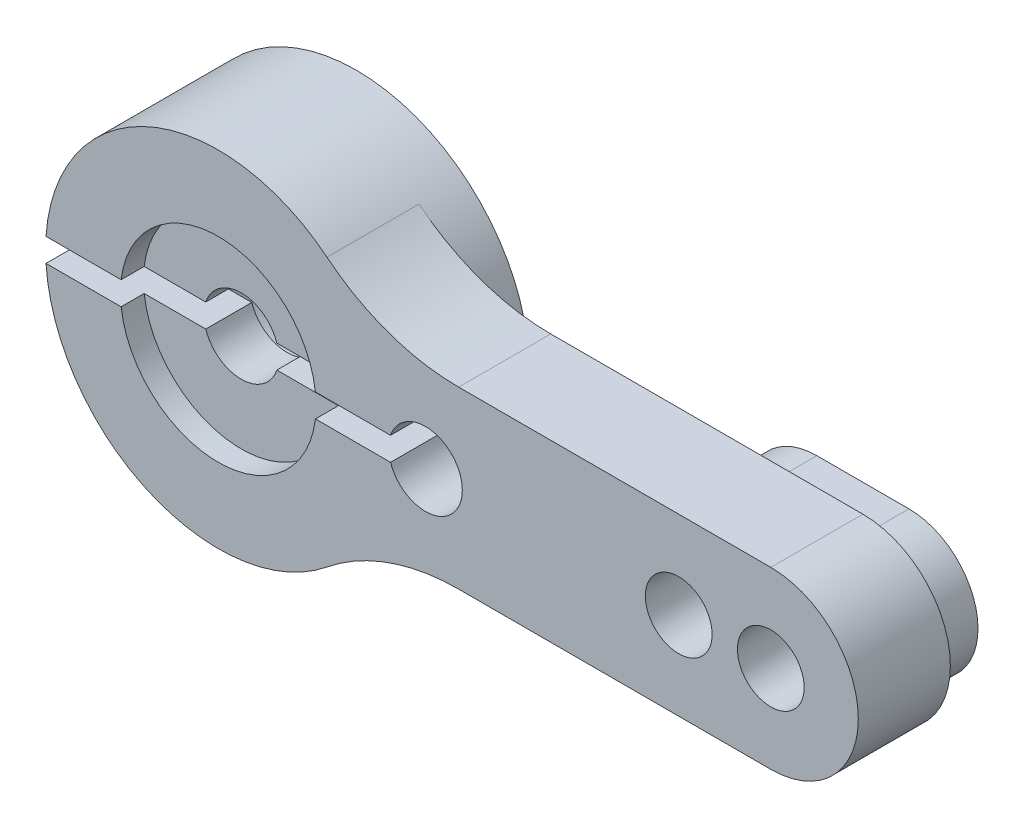
ISO-10303-21;
HEADER;
FILE_DESCRIPTION(('STEP AP214'),'2;1');
FILE_NAME('part.step','',(''),(''),'','','');
FILE_SCHEMA(('AUTOMOTIVE_DESIGN { 1 0 10303 214 1 1 1 1 }'));
ENDSEC;
DATA;
#1=APPLICATION_CONTEXT('core data for automotive mechanical design processes');
#2=APPLICATION_PROTOCOL_DEFINITION('international standard','automotive_design',2000,#1);
#3=PRODUCT_CONTEXT('',#1,'mechanical');
#4=PRODUCT('Part','Part','',(#3));
#5=PRODUCT_RELATED_PRODUCT_CATEGORY('part','',(#4));
#6=PRODUCT_DEFINITION_FORMATION('','',#4);
#7=PRODUCT_DEFINITION_CONTEXT('part definition',#1,'design');
#8=PRODUCT_DEFINITION('design','',#6,#7);
#9=PRODUCT_DEFINITION_SHAPE('','',#8);
#10=(LENGTH_UNIT() NAMED_UNIT(*) SI_UNIT(.MILLI.,.METRE.));
#11=(NAMED_UNIT(*) PLANE_ANGLE_UNIT() SI_UNIT($,.RADIAN.));
#12=(NAMED_UNIT(*) SI_UNIT($,.STERADIAN.) SOLID_ANGLE_UNIT());
#13=UNCERTAINTY_MEASURE_WITH_UNIT(LENGTH_MEASURE(1.E-05),#10,'distance_accuracy_value','');
#14=(GEOMETRIC_REPRESENTATION_CONTEXT(3) GLOBAL_UNCERTAINTY_ASSIGNED_CONTEXT((#13)) GLOBAL_UNIT_ASSIGNED_CONTEXT((#10,
#11,#12)) REPRESENTATION_CONTEXT('',''));
#15=CARTESIAN_POINT('',(0.,0.,0.));
#16=DIRECTION('',(0.,0.,1.));
#17=DIRECTION('',(1.,0.,0.));
#18=AXIS2_PLACEMENT_3D('',#15,#16,#17);
#19=CARTESIAN_POINT('',(0.,0.,4.));
#20=DIRECTION('',(0.,0.,-1.));
#21=DIRECTION('',(-1.,0.,0.));
#22=AXIS2_PLACEMENT_3D('',#19,#20,#21);
#23=CYLINDRICAL_SURFACE('',#22,1.625);
#24=DIRECTION('',(0.,0.,-1.));
#25=VECTOR('',#24,1.);
#26=CARTESIAN_POINT('',(-1.54356349775607,0.507973157159964,4.));
#27=LINE('',#26,#25);
#28=CARTESIAN_POINT('',(-1.54356349775607,0.507973157159964,3.));
#29=VERTEX_POINT('',#28);
#30=CARTESIAN_POINT('',(-1.54356349775607,0.507973157159964,1.));
#31=VERTEX_POINT('',#30);
#32=EDGE_CURVE('E459',#29,#31,#27,.T.);
#33=ORIENTED_EDGE('',*,*,#32,.T.);
#34=CARTESIAN_POINT('',(0.,0.,1.));
#35=DIRECTION('',(0.,0.,-1.));
#36=DIRECTION('',(-1.,0.,0.));
#37=AXIS2_PLACEMENT_3D('',#34,#35,#36);
#38=CIRCLE('',#37,1.625);
#39=CARTESIAN_POINT('',(1.54356349775607,0.507973157159964,1.));
#40=VERTEX_POINT('',#39);
#41=EDGE_CURVE('E253',#31,#40,#38,.T.);
#42=ORIENTED_EDGE('',*,*,#41,.T.);
#43=DIRECTION('',(0.,0.,-1.));
#44=VECTOR('',#43,1.);
#45=CARTESIAN_POINT('',(1.54356349775607,0.507973157159964,4.));
#46=LINE('',#45,#44);
#47=CARTESIAN_POINT('',(1.54356349775607,0.507973157159964,3.));
#48=VERTEX_POINT('',#47);
#49=EDGE_CURVE('E374',#48,#40,#46,.T.);
#50=ORIENTED_EDGE('',*,*,#49,.F.);
#51=CARTESIAN_POINT('',(0.,0.,3.));
#52=DIRECTION('',(0.,0.,1.));
#53=DIRECTION('',(1.,0.,0.));
#54=AXIS2_PLACEMENT_3D('',#51,#52,#53);
#55=CIRCLE('',#54,1.625);
#56=EDGE_CURVE('E298',#48,#29,#55,.T.);
#57=ORIENTED_EDGE('',*,*,#56,.T.);
#58=EDGE_LOOP('',(#33,#42,#50,#57));
#59=FACE_BOUND('',#58,.T.);
#60=ADVANCED_FACE('F52',(#59),#23,.F.);
#61=CARTESIAN_POINT('',(0.,0.,4.));
#62=DIRECTION('',(0.,0.,-1.));
#63=DIRECTION('',(-1.,0.,0.));
#64=AXIS2_PLACEMENT_3D('',#61,#62,#63);
#65=CYLINDRICAL_SURFACE('',#64,1.625);
#66=DIRECTION('',(0.,0.,-1.));
#67=VECTOR('',#66,1.);
#68=CARTESIAN_POINT('',(1.54356349775606,-0.507973157159965,4.));
#69=LINE('',#68,#67);
#70=CARTESIAN_POINT('',(1.54356349775606,-0.507973157159965,3.));
#71=VERTEX_POINT('',#70);
#72=CARTESIAN_POINT('',(1.54356349775606,-0.507973157159965,1.));
#73=VERTEX_POINT('',#72);
#74=EDGE_CURVE('E520',#71,#73,#69,.T.);
#75=ORIENTED_EDGE('',*,*,#74,.T.);
#76=CARTESIAN_POINT('',(0.,0.,1.));
#77=DIRECTION('',(0.,0.,-1.));
#78=DIRECTION('',(-1.,0.,0.));
#79=AXIS2_PLACEMENT_3D('',#76,#77,#78);
#80=CIRCLE('',#79,1.625);
#81=CARTESIAN_POINT('',(-1.54356349775606,-0.507973157159965,1.));
#82=VERTEX_POINT('',#81);
#83=EDGE_CURVE('E271',#73,#82,#80,.T.);
#84=ORIENTED_EDGE('',*,*,#83,.T.);
#85=DIRECTION('',(0.,0.,-1.));
#86=VECTOR('',#85,1.);
#87=CARTESIAN_POINT('',(-1.54356349775606,-0.507973157159965,4.));
#88=LINE('',#87,#86);
#89=CARTESIAN_POINT('',(-1.54356349775606,-0.507973157159965,3.));
#90=VERTEX_POINT('',#89);
#91=EDGE_CURVE('E516',#90,#82,#88,.T.);
#92=ORIENTED_EDGE('',*,*,#91,.F.);
#93=CARTESIAN_POINT('',(0.,0.,3.));
#94=DIRECTION('',(0.,0.,1.));
#95=DIRECTION('',(1.,0.,0.));
#96=AXIS2_PLACEMENT_3D('',#93,#94,#95);
#97=CIRCLE('',#96,1.625);
#98=EDGE_CURVE('E309',#90,#71,#97,.T.);
#99=ORIENTED_EDGE('',*,*,#98,.T.);
#100=EDGE_LOOP('',(#75,#84,#92,#99));
#101=FACE_BOUND('',#100,.T.);
#102=ADVANCED_FACE('F588',(#101),#65,.F.);
#103=CARTESIAN_POINT('',(0.,0.,0.));
#104=DIRECTION('',(0.,0.,1.));
#105=DIRECTION('',(1.,0.,0.));
#106=AXIS2_PLACEMENT_3D('',#103,#104,#105);
#107=PLANE('',#106);
#108=CARTESIAN_POINT('',(20.,0.,0.));
#109=DIRECTION('',(0.,0.,-1.));
#110=DIRECTION('',(-1.,0.,0.));
#111=AXIS2_PLACEMENT_3D('',#108,#109,#110);
#112=CIRCLE('',#111,3.);
#113=CARTESIAN_POINT('',(20.,-3.,0.));
#114=VERTEX_POINT('',#113);
#115=CARTESIAN_POINT('',(20.,3.,0.));
#116=VERTEX_POINT('',#115);
#117=EDGE_CURVE('E347',#114,#116,#112,.T.);
#118=ORIENTED_EDGE('',*,*,#117,.F.);
#119=DIRECTION('',(-1.,0.,0.));
#120=VECTOR('',#119,1.);
#121=CARTESIAN_POINT('',(20.,-3.,0.));
#122=LINE('',#121,#120);
#123=CARTESIAN_POINT('',(24.,-3.,0.));
#124=VERTEX_POINT('',#123);
#125=EDGE_CURVE('E334',#124,#114,#122,.T.);
#126=ORIENTED_EDGE('',*,*,#125,.F.);
#127=CARTESIAN_POINT('',(24.,0.,0.));
#128=DIRECTION('',(0.,0.,-1.));
#129=DIRECTION('',(-1.,0.,0.));
#130=AXIS2_PLACEMENT_3D('',#127,#128,#129);
#131=CIRCLE('',#130,3.);
#132=CARTESIAN_POINT('',(24.,3.,0.));
#133=VERTEX_POINT('',#132);
#134=EDGE_CURVE('E338',#133,#124,#131,.T.);
#135=ORIENTED_EDGE('',*,*,#134,.F.);
#136=DIRECTION('',(1.,0.,0.));
#137=VECTOR('',#136,1.);
#138=CARTESIAN_POINT('',(24.,3.,0.));
#139=LINE('',#138,#137);
#140=EDGE_CURVE('E343',#116,#133,#139,.T.);
#141=ORIENTED_EDGE('',*,*,#140,.F.);
#142=EDGE_LOOP('',(#118,#126,#135,#141));
#143=FACE_BOUND('',#142,.T.);
#144=CARTESIAN_POINT('',(0.,0.,0.));
#145=DIRECTION('',(0.,0.,-1.));
#146=DIRECTION('',(-1.,0.,0.));
#147=AXIS2_PLACEMENT_3D('',#144,#145,#146);
#148=CIRCLE('',#147,7.5);
#149=CARTESIAN_POINT('',(4.72209122449602,5.82682198694434,0.));
#150=VERTEX_POINT('',#149);
#151=CARTESIAN_POINT('',(7.48277777777778,0.507973157159964,0.));
#152=VERTEX_POINT('',#151);
#153=EDGE_CURVE('E369',#150,#152,#148,.T.);
#154=ORIENTED_EDGE('',*,*,#153,.F.);
#155=CARTESIAN_POINT('',(10.4422466673028,12.8852047919995,0.));
#156=DIRECTION('',(0.,0.,1.));
#157=DIRECTION('',(1.,0.,0.));
#158=AXIS2_PLACEMENT_3D('',#155,#156,#157);
#159=CIRCLE('',#158,9.08520479199948);
#160=CARTESIAN_POINT('',(10.4422466673028,3.8,0.));
#161=VERTEX_POINT('',#160);
#162=EDGE_CURVE('E476',#150,#161,#159,.T.);
#163=ORIENTED_EDGE('',*,*,#162,.T.);
#164=DIRECTION('',(-1.,0.,0.));
#165=VECTOR('',#164,1.);
#166=CARTESIAN_POINT('',(0.,3.8,0.));
#167=LINE('',#166,#165);
#168=CARTESIAN_POINT('',(24.,3.8,0.));
#169=VERTEX_POINT('',#168);
#170=EDGE_CURVE('E472',#169,#161,#167,.T.);
#171=ORIENTED_EDGE('',*,*,#170,.F.);
#172=CARTESIAN_POINT('',(24.,0.,0.));
#173=DIRECTION('',(0.,0.,1.));
#174=DIRECTION('',(1.,0.,0.));
#175=AXIS2_PLACEMENT_3D('',#172,#173,#174);
#176=CIRCLE('',#175,3.8);
#177=CARTESIAN_POINT('',(24.,-3.8,0.));
#178=VERTEX_POINT('',#177);
#179=EDGE_CURVE('E469',#178,#169,#176,.T.);
#180=ORIENTED_EDGE('',*,*,#179,.F.);
#181=DIRECTION('',(1.,0.,0.));
#182=VECTOR('',#181,1.);
#183=CARTESIAN_POINT('',(0.,-3.8,0.));
#184=LINE('',#183,#182);
#185=CARTESIAN_POINT('',(10.4422466673028,-3.8,0.));
#186=VERTEX_POINT('',#185);
#187=EDGE_CURVE('E466',#186,#178,#184,.T.);
#188=ORIENTED_EDGE('',*,*,#187,.F.);
#189=CARTESIAN_POINT('',(10.4422466673028,-12.8852047919995,0.));
#190=DIRECTION('',(0.,0.,1.));
#191=DIRECTION('',(1.,0.,0.));
#192=AXIS2_PLACEMENT_3D('',#189,#190,#191);
#193=CIRCLE('',#192,9.08520479199948);
#194=CARTESIAN_POINT('',(4.72209122449602,-5.82682198694434,0.));
#195=VERTEX_POINT('',#194);
#196=EDGE_CURVE('E462',#186,#195,#193,.T.);
#197=ORIENTED_EDGE('',*,*,#196,.T.);
#198=CARTESIAN_POINT('',(0.,0.,0.));
#199=DIRECTION('',(0.,0.,-1.));
#200=DIRECTION('',(-1.,0.,0.));
#201=AXIS2_PLACEMENT_3D('',#198,#199,#200);
#202=CIRCLE('',#201,7.5);
#203=CARTESIAN_POINT('',(7.48277777777778,-0.507973157159965,0.));
#204=VERTEX_POINT('',#203);
#205=EDGE_CURVE('E351',#204,#195,#202,.T.);
#206=ORIENTED_EDGE('',*,*,#205,.F.);
#207=CARTESIAN_POINT('',(9.,0.,0.));
#208=DIRECTION('',(0.,0.,1.));
#209=DIRECTION('',(1.,0.,0.));
#210=AXIS2_PLACEMENT_3D('',#207,#208,#209);
#211=CIRCLE('',#210,1.6);
#212=EDGE_CURVE('E410',#204,#152,#211,.T.);
#213=ORIENTED_EDGE('',*,*,#212,.T.);
#214=EDGE_LOOP('',(#154,#163,#171,#180,#188,#197,#206,#213));
#215=FACE_BOUND('',#214,.T.);
#216=ADVANCED_FACE('F563',(#143,#215),#107,.F.);
#217=CARTESIAN_POINT('',(0.,0.507973157159964,4.));
#218=DIRECTION('',(0.,-1.,0.));
#219=DIRECTION('',(0.,0.,-1.));
#220=AXIS2_PLACEMENT_3D('',#217,#218,#219);
#221=PLANE('',#220);
#222=DIRECTION('',(1.,0.,0.));
#223=VECTOR('',#222,1.);
#224=CARTESIAN_POINT('',(0.,0.507973157159964,1.));
#225=LINE('',#224,#223);
#226=CARTESIAN_POINT('',(2.85516431604294,0.507973157159964,1.));
#227=VERTEX_POINT('',#226);
#228=EDGE_CURVE('E262',#40,#227,#225,.T.);
#229=ORIENTED_EDGE('',*,*,#228,.T.);
#230=DIRECTION('',(0.,0.,1.));
#231=VECTOR('',#230,1.);
#232=CARTESIAN_POINT('',(2.85516431604294,0.507973157159964,-2.));
#233=LINE('',#232,#231);
#234=CARTESIAN_POINT('',(2.85516431604294,0.507973157159964,-2.));
#235=VERTEX_POINT('',#234);
#236=EDGE_CURVE('E256',#235,#227,#233,.T.);
#237=ORIENTED_EDGE('',*,*,#236,.F.);
#238=DIRECTION('',(-1.,0.,0.));
#239=VECTOR('',#238,1.);
#240=CARTESIAN_POINT('',(7.48277777777778,0.507973157159964,-2.));
#241=LINE('',#240,#239);
#242=CARTESIAN_POINT('',(7.48277777777778,0.507973157159964,-2.));
#243=VERTEX_POINT('',#242);
#244=EDGE_CURVE('E368',#243,#235,#241,.T.);
#245=ORIENTED_EDGE('',*,*,#244,.F.);
#246=DIRECTION('',(0.,0.,1.));
#247=VECTOR('',#246,1.);
#248=CARTESIAN_POINT('',(7.48277777777778,0.507973157159964,-2.));
#249=LINE('',#248,#247);
#250=EDGE_CURVE('E244',#243,#152,#249,.T.);
#251=ORIENTED_EDGE('',*,*,#250,.T.);
#252=DIRECTION('',(0.,0.,-1.));
#253=VECTOR('',#252,1.);
#254=CARTESIAN_POINT('',(7.48277777777778,0.507973157159964,4.));
#255=LINE('',#254,#253);
#256=CARTESIAN_POINT('',(7.48277777777778,0.507973157159964,4.));
#257=VERTEX_POINT('',#256);
#258=EDGE_CURVE('E528',#257,#152,#255,.T.);
#259=ORIENTED_EDGE('',*,*,#258,.F.);
#260=DIRECTION('',(-1.,0.,0.));
#261=VECTOR('',#260,1.);
#262=CARTESIAN_POINT('',(0.,0.507973157159964,4.));
#263=LINE('',#262,#261);
#264=CARTESIAN_POINT('',(4.21953353720585,0.507973157159964,4.));
#265=VERTEX_POINT('',#264);
#266=EDGE_CURVE('E411',#257,#265,#263,.T.);
#267=ORIENTED_EDGE('',*,*,#266,.T.);
#268=DIRECTION('',(0.,0.,1.));
#269=VECTOR('',#268,1.);
#270=CARTESIAN_POINT('',(4.21953353720585,0.507973157159964,3.));
#271=LINE('',#270,#269);
#272=CARTESIAN_POINT('',(4.21953353720585,0.507973157159964,3.));
#273=VERTEX_POINT('',#272);
#274=EDGE_CURVE('E75',#273,#265,#271,.T.);
#275=ORIENTED_EDGE('',*,*,#274,.F.);
#276=DIRECTION('',(-1.,0.,0.));
#277=VECTOR('',#276,1.);
#278=CARTESIAN_POINT('',(0.,0.507973157159964,3.));
#279=LINE('',#278,#277);
#280=EDGE_CURVE('E302',#273,#48,#279,.T.);
#281=ORIENTED_EDGE('',*,*,#280,.T.);
#282=ORIENTED_EDGE('',*,*,#49,.T.);
#283=EDGE_LOOP('',(#229,#237,#245,#251,#259,#267,#275,#281,#282));
#284=FACE_BOUND('',#283,.T.);
#285=ADVANCED_FACE('F543',(#284),#221,.T.);
#286=CARTESIAN_POINT('',(9.,0.,4.));
#287=DIRECTION('',(0.,0.,-1.));
#288=DIRECTION('',(-1.,0.,0.));
#289=AXIS2_PLACEMENT_3D('',#286,#287,#288);
#290=CYLINDRICAL_SURFACE('',#289,1.6);
#291=ORIENTED_EDGE('',*,*,#212,.F.);
#292=DIRECTION('',(0.,0.,-1.));
#293=VECTOR('',#292,1.);
#294=CARTESIAN_POINT('',(7.48277777777778,-0.507973157159965,4.));
#295=LINE('',#294,#293);
#296=CARTESIAN_POINT('',(7.48277777777778,-0.507973157159965,4.));
#297=VERTEX_POINT('',#296);
#298=EDGE_CURVE('E524',#297,#204,#295,.T.);
#299=ORIENTED_EDGE('',*,*,#298,.F.);
#300=CARTESIAN_POINT('',(9.,0.,4.));
#301=DIRECTION('',(0.,0.,1.));
#302=DIRECTION('',(1.,0.,0.));
#303=AXIS2_PLACEMENT_3D('',#300,#301,#302);
#304=CIRCLE('',#303,1.6);
#305=EDGE_CURVE('E415',#297,#257,#304,.T.);
#306=ORIENTED_EDGE('',*,*,#305,.T.);
#307=ORIENTED_EDGE('',*,*,#258,.T.);
#308=EDGE_LOOP('',(#291,#299,#306,#307));
#309=FACE_BOUND('',#308,.T.);
#310=ADVANCED_FACE('F568',(#309),#290,.F.);
#311=CARTESIAN_POINT('',(0.,-0.507973157159965,4.));
#312=DIRECTION('',(0.,1.,0.));
#313=DIRECTION('',(0.,0.,1.));
#314=AXIS2_PLACEMENT_3D('',#311,#312,#313);
#315=PLANE('',#314);
#316=DIRECTION('',(0.,0.,1.));
#317=VECTOR('',#316,1.);
#318=CARTESIAN_POINT('',(2.85516431604294,-0.507973157159963,-2.));
#319=LINE('',#318,#317);
#320=CARTESIAN_POINT('',(2.85516431604294,-0.507973157159963,-2.));
#321=VERTEX_POINT('',#320);
#322=CARTESIAN_POINT('',(2.85516431604294,-0.507973157159965,1.));
#323=VERTEX_POINT('',#322);
#324=EDGE_CURVE('E404',#321,#323,#319,.T.);
#325=ORIENTED_EDGE('',*,*,#324,.T.);
#326=DIRECTION('',(-1.,0.,0.));
#327=VECTOR('',#326,1.);
#328=CARTESIAN_POINT('',(0.,-0.507973157159965,1.));
#329=LINE('',#328,#327);
#330=EDGE_CURVE('E275',#323,#73,#329,.T.);
#331=ORIENTED_EDGE('',*,*,#330,.T.);
#332=ORIENTED_EDGE('',*,*,#74,.F.);
#333=DIRECTION('',(1.,0.,0.));
#334=VECTOR('',#333,1.);
#335=CARTESIAN_POINT('',(0.,-0.507973157159965,3.));
#336=LINE('',#335,#334);
#337=CARTESIAN_POINT('',(4.21953353720585,-0.507973157159965,3.));
#338=VERTEX_POINT('',#337);
#339=EDGE_CURVE('E245',#71,#338,#336,.T.);
#340=ORIENTED_EDGE('',*,*,#339,.T.);
#341=DIRECTION('',(0.,0.,1.));
#342=VECTOR('',#341,1.);
#343=CARTESIAN_POINT('',(4.21953353720585,-0.507973157159965,3.));
#344=LINE('',#343,#342);
#345=CARTESIAN_POINT('',(4.21953353720585,-0.507973157159965,4.));
#346=VERTEX_POINT('',#345);
#347=EDGE_CURVE('E293',#346,#338,#344,.F.);
#348=ORIENTED_EDGE('',*,*,#347,.F.);
#349=DIRECTION('',(1.,0.,0.));
#350=VECTOR('',#349,1.);
#351=CARTESIAN_POINT('',(0.,-0.507973157159965,4.));
#352=LINE('',#351,#350);
#353=EDGE_CURVE('E420',#346,#297,#352,.T.);
#354=ORIENTED_EDGE('',*,*,#353,.T.);
#355=ORIENTED_EDGE('',*,*,#298,.T.);
#356=DIRECTION('',(0.,0.,1.));
#357=VECTOR('',#356,1.);
#358=CARTESIAN_POINT('',(7.48277777777778,-0.507973157159965,-2.));
#359=LINE('',#358,#357);
#360=CARTESIAN_POINT('',(7.48277777777778,-0.507973157159965,-2.));
#361=VERTEX_POINT('',#360);
#362=EDGE_CURVE('E397',#361,#204,#359,.T.);
#363=ORIENTED_EDGE('',*,*,#362,.F.);
#364=DIRECTION('',(1.,0.,0.));
#365=VECTOR('',#364,1.);
#366=CARTESIAN_POINT('',(7.48277777777778,-0.507973157159965,-2.));
#367=LINE('',#366,#365);
#368=EDGE_CURVE('E394',#321,#361,#367,.T.);
#369=ORIENTED_EDGE('',*,*,#368,.F.);
#370=EDGE_LOOP('',(#325,#331,#332,#340,#348,#354,#355,#363,#369));
#371=FACE_BOUND('',#370,.T.);
#372=ADVANCED_FACE('F574',(#371),#315,.T.);
#373=CARTESIAN_POINT('',(0.,-0.507973157159965,4.));
#374=DIRECTION('',(0.,-1.,0.));
#375=DIRECTION('',(0.,0.,-1.));
#376=AXIS2_PLACEMENT_3D('',#373,#374,#375);
#377=PLANE('',#376);
#378=DIRECTION('',(1.,0.,0.));
#379=VECTOR('',#378,1.);
#380=CARTESIAN_POINT('',(0.,-0.507973157159965,1.));
#381=LINE('',#380,#379);
#382=CARTESIAN_POINT('',(-2.85516431604294,-0.507973157159965,1.));
#383=VERTEX_POINT('',#382);
#384=EDGE_CURVE('E268',#383,#82,#381,.T.);
#385=ORIENTED_EDGE('',*,*,#384,.F.);
#386=DIRECTION('',(0.,0.,1.));
#387=VECTOR('',#386,1.);
#388=CARTESIAN_POINT('',(-2.85516431604294,-0.507973157159965,-2.));
#389=LINE('',#388,#387);
#390=CARTESIAN_POINT('',(-2.85516431604294,-0.507973157159965,-2.));
#391=VERTEX_POINT('',#390);
#392=EDGE_CURVE('E407',#391,#383,#389,.T.);
#393=ORIENTED_EDGE('',*,*,#392,.F.);
#394=DIRECTION('',(1.,0.,0.));
#395=VECTOR('',#394,1.);
#396=CARTESIAN_POINT('',(-7.48277777777778,-0.507973157159965,-2.));
#397=LINE('',#396,#395);
#398=CARTESIAN_POINT('',(-7.48277777777778,-0.507973157159965,-2.));
#399=VERTEX_POINT('',#398);
#400=EDGE_CURVE('E388',#399,#391,#397,.T.);
#401=ORIENTED_EDGE('',*,*,#400,.F.);
#402=DIRECTION('',(0.,0.,-1.));
#403=VECTOR('',#402,1.);
#404=CARTESIAN_POINT('',(-7.48277777777778,-0.507973157159965,4.));
#405=LINE('',#404,#403);
#406=CARTESIAN_POINT('',(-7.48277777777778,-0.507973157159965,4.));
#407=VERTEX_POINT('',#406);
#408=EDGE_CURVE('E513',#407,#399,#405,.T.);
#409=ORIENTED_EDGE('',*,*,#408,.F.);
#410=DIRECTION('',(-1.,0.,0.));
#411=VECTOR('',#410,1.);
#412=CARTESIAN_POINT('',(0.,-0.507973157159965,4.));
#413=LINE('',#412,#411);
#414=CARTESIAN_POINT('',(-4.21953353720585,-0.507973157159965,4.));
#415=VERTEX_POINT('',#414);
#416=EDGE_CURVE('E423',#415,#407,#413,.T.);
#417=ORIENTED_EDGE('',*,*,#416,.F.);
#418=DIRECTION('',(0.,0.,1.));
#419=VECTOR('',#418,1.);
#420=CARTESIAN_POINT('',(-4.21953353720585,-0.507973157159965,3.));
#421=LINE('',#420,#419);
#422=CARTESIAN_POINT('',(-4.21953353720585,-0.507973157159965,3.));
#423=VERTEX_POINT('',#422);
#424=EDGE_CURVE('E67',#415,#423,#421,.F.);
#425=ORIENTED_EDGE('',*,*,#424,.T.);
#426=DIRECTION('',(-1.,0.,0.));
#427=VECTOR('',#426,1.);
#428=CARTESIAN_POINT('',(0.,-0.507973157159965,3.));
#429=LINE('',#428,#427);
#430=EDGE_CURVE('E306',#90,#423,#429,.T.);
#431=ORIENTED_EDGE('',*,*,#430,.F.);
#432=ORIENTED_EDGE('',*,*,#91,.T.);
#433=EDGE_LOOP('',(#385,#393,#401,#409,#417,#425,#431,#432));
#434=FACE_BOUND('',#433,.T.);
#435=ADVANCED_FACE('F586',(#434),#377,.F.);
#436=CARTESIAN_POINT('',(0.,0.,4.));
#437=DIRECTION('',(0.,0.,-1.));
#438=DIRECTION('',(-1.,0.,0.));
#439=AXIS2_PLACEMENT_3D('',#436,#437,#438);
#440=CYLINDRICAL_SURFACE('',#439,7.50000000000002);
#441=ORIENTED_EDGE('',*,*,#408,.T.);
#442=CARTESIAN_POINT('',(0.,0.,-2.));
#443=DIRECTION('',(0.,0.,-1.));
#444=DIRECTION('',(-1.,0.,0.));
#445=AXIS2_PLACEMENT_3D('',#442,#443,#444);
#446=CIRCLE('',#445,7.5);
#447=EDGE_CURVE('E384',#361,#399,#446,.T.);
#448=ORIENTED_EDGE('',*,*,#447,.F.);
#449=ORIENTED_EDGE('',*,*,#362,.T.);
#450=ORIENTED_EDGE('',*,*,#205,.T.);
#451=DIRECTION('',(0.,0.,-1.));
#452=VECTOR('',#451,1.);
#453=CARTESIAN_POINT('',(4.72209122449602,-5.82682198694434,4.));
#454=LINE('',#453,#452);
#455=CARTESIAN_POINT('',(4.72209122449602,-5.82682198694434,4.));
#456=VERTEX_POINT('',#455);
#457=EDGE_CURVE('E510',#456,#195,#454,.T.);
#458=ORIENTED_EDGE('',*,*,#457,.F.);
#459=CARTESIAN_POINT('',(0.,0.,4.));
#460=DIRECTION('',(0.,0.,1.));
#461=DIRECTION('',(1.,0.,0.));
#462=AXIS2_PLACEMENT_3D('',#459,#460,#461);
#463=CIRCLE('',#462,7.50000000000002);
#464=EDGE_CURVE('E426',#407,#456,#463,.T.);
#465=ORIENTED_EDGE('',*,*,#464,.F.);
#466=EDGE_LOOP('',(#441,#448,#449,#450,#458,#465));
#467=FACE_BOUND('',#466,.T.);
#468=ADVANCED_FACE('F606',(#467),#440,.T.);
#469=CARTESIAN_POINT('',(10.4422466673028,-12.8852047919995,4.));
#470=DIRECTION('',(0.,0.,-1.));
#471=DIRECTION('',(-1.,0.,0.));
#472=AXIS2_PLACEMENT_3D('',#469,#470,#471);
#473=CYLINDRICAL_SURFACE('',#472,9.08520479199948);
#474=ORIENTED_EDGE('',*,*,#196,.F.);
#475=DIRECTION('',(0.,0.,-1.));
#476=VECTOR('',#475,1.);
#477=CARTESIAN_POINT('',(10.4422466673028,-3.8,4.));
#478=LINE('',#477,#476);
#479=CARTESIAN_POINT('',(10.4422466673028,-3.8,4.));
#480=VERTEX_POINT('',#479);
#481=EDGE_CURVE('E507',#480,#186,#478,.T.);
#482=ORIENTED_EDGE('',*,*,#481,.F.);
#483=CARTESIAN_POINT('',(10.4422466673028,-12.8852047919995,4.));
#484=DIRECTION('',(0.,0.,1.));
#485=DIRECTION('',(1.,0.,0.));
#486=AXIS2_PLACEMENT_3D('',#483,#484,#485);
#487=CIRCLE('',#486,9.08520479199948);
#488=EDGE_CURVE('E429',#480,#456,#487,.T.);
#489=ORIENTED_EDGE('',*,*,#488,.T.);
#490=ORIENTED_EDGE('',*,*,#457,.T.);
#491=EDGE_LOOP('',(#474,#482,#489,#490));
#492=FACE_BOUND('',#491,.T.);
#493=ADVANCED_FACE('F613',(#492),#473,.F.);
#494=CARTESIAN_POINT('',(0.,-3.8,4.));
#495=DIRECTION('',(0.,1.,0.));
#496=DIRECTION('',(-1.,0.,0.));
#497=AXIS2_PLACEMENT_3D('',#494,#495,#496);
#498=PLANE('',#497);
#499=ORIENTED_EDGE('',*,*,#187,.T.);
#500=DIRECTION('',(0.,0.,-1.));
#501=VECTOR('',#500,1.);
#502=CARTESIAN_POINT('',(24.,-3.8,4.));
#503=LINE('',#502,#501);
#504=CARTESIAN_POINT('',(24.,-3.8,4.));
#505=VERTEX_POINT('',#504);
#506=EDGE_CURVE('E503',#505,#178,#503,.T.);
#507=ORIENTED_EDGE('',*,*,#506,.F.);
#508=DIRECTION('',(1.,0.,0.));
#509=VECTOR('',#508,1.);
#510=CARTESIAN_POINT('',(0.,-3.8,4.));
#511=LINE('',#510,#509);
#512=EDGE_CURVE('E434',#480,#505,#511,.T.);
#513=ORIENTED_EDGE('',*,*,#512,.F.);
#514=ORIENTED_EDGE('',*,*,#481,.T.);
#515=EDGE_LOOP('',(#499,#507,#513,#514));
#516=FACE_BOUND('',#515,.T.);
#517=ADVANCED_FACE('F616',(#516),#498,.F.);
#518=CARTESIAN_POINT('',(24.,0.,4.));
#519=DIRECTION('',(0.,0.,-1.));
#520=DIRECTION('',(-1.,0.,0.));
#521=AXIS2_PLACEMENT_3D('',#518,#519,#520);
#522=CYLINDRICAL_SURFACE('',#521,3.8);
#523=ORIENTED_EDGE('',*,*,#179,.T.);
#524=DIRECTION('',(0.,0.,-1.));
#525=VECTOR('',#524,1.);
#526=CARTESIAN_POINT('',(24.,3.8,4.));
#527=LINE('',#526,#525);
#528=CARTESIAN_POINT('',(24.,3.8,4.));
#529=VERTEX_POINT('',#528);
#530=EDGE_CURVE('E499',#529,#169,#527,.T.);
#531=ORIENTED_EDGE('',*,*,#530,.F.);
#532=CARTESIAN_POINT('',(24.,0.,4.));
#533=DIRECTION('',(0.,0.,1.));
#534=DIRECTION('',(1.,0.,0.));
#535=AXIS2_PLACEMENT_3D('',#532,#533,#534);
#536=CIRCLE('',#535,3.8);
#537=EDGE_CURVE('E437',#505,#529,#536,.T.);
#538=ORIENTED_EDGE('',*,*,#537,.F.);
#539=ORIENTED_EDGE('',*,*,#506,.T.);
#540=EDGE_LOOP('',(#523,#531,#538,#539));
#541=FACE_BOUND('',#540,.T.);
#542=ADVANCED_FACE('F621',(#541),#522,.T.);
#543=CARTESIAN_POINT('',(0.,3.8,4.));
#544=DIRECTION('',(0.,-1.,0.));
#545=DIRECTION('',(0.,0.,-1.));
#546=AXIS2_PLACEMENT_3D('',#543,#544,#545);
#547=PLANE('',#546);
#548=ORIENTED_EDGE('',*,*,#170,.T.);
#549=DIRECTION('',(0.,0.,-1.));
#550=VECTOR('',#549,1.);
#551=CARTESIAN_POINT('',(10.4422466673028,3.8,4.));
#552=LINE('',#551,#550);
#553=CARTESIAN_POINT('',(10.4422466673028,3.8,4.));
#554=VERTEX_POINT('',#553);
#555=EDGE_CURVE('E496',#554,#161,#552,.T.);
#556=ORIENTED_EDGE('',*,*,#555,.F.);
#557=DIRECTION('',(-1.,0.,0.));
#558=VECTOR('',#557,1.);
#559=CARTESIAN_POINT('',(0.,3.8,4.));
#560=LINE('',#559,#558);
#561=EDGE_CURVE('E440',#529,#554,#560,.T.);
#562=ORIENTED_EDGE('',*,*,#561,.F.);
#563=ORIENTED_EDGE('',*,*,#530,.T.);
#564=EDGE_LOOP('',(#548,#556,#562,#563));
#565=FACE_BOUND('',#564,.T.);
#566=ADVANCED_FACE('F625',(#565),#547,.F.);
#567=CARTESIAN_POINT('',(10.4422466673028,12.8852047919995,4.));
#568=DIRECTION('',(0.,0.,-1.));
#569=DIRECTION('',(-1.,0.,0.));
#570=AXIS2_PLACEMENT_3D('',#567,#568,#569);
#571=CYLINDRICAL_SURFACE('',#570,9.08520479199948);
#572=ORIENTED_EDGE('',*,*,#162,.F.);
#573=DIRECTION('',(0.,0.,-1.));
#574=VECTOR('',#573,1.);
#575=CARTESIAN_POINT('',(4.72209122449602,5.82682198694434,4.));
#576=LINE('',#575,#574);
#577=CARTESIAN_POINT('',(4.72209122449602,5.82682198694434,4.));
#578=VERTEX_POINT('',#577);
#579=EDGE_CURVE('E492',#578,#150,#576,.T.);
#580=ORIENTED_EDGE('',*,*,#579,.F.);
#581=CARTESIAN_POINT('',(10.4422466673028,12.8852047919995,4.));
#582=DIRECTION('',(0.,0.,1.));
#583=DIRECTION('',(1.,0.,0.));
#584=AXIS2_PLACEMENT_3D('',#581,#582,#583);
#585=CIRCLE('',#584,9.08520479199948);
#586=EDGE_CURVE('E443',#578,#554,#585,.T.);
#587=ORIENTED_EDGE('',*,*,#586,.T.);
#588=ORIENTED_EDGE('',*,*,#555,.T.);
#589=EDGE_LOOP('',(#572,#580,#587,#588));
#590=FACE_BOUND('',#589,.T.);
#591=ADVANCED_FACE('F627',(#590),#571,.F.);
#592=ORIENTED_EDGE('',*,*,#579,.T.);
#593=ORIENTED_EDGE('',*,*,#153,.T.);
#594=ORIENTED_EDGE('',*,*,#250,.F.);
#595=CARTESIAN_POINT('',(0.,0.,-2.));
#596=DIRECTION('',(0.,0.,-1.));
#597=DIRECTION('',(-1.,0.,0.));
#598=AXIS2_PLACEMENT_3D('',#595,#596,#597);
#599=CIRCLE('',#598,7.5);
#600=CARTESIAN_POINT('',(-7.48277777777778,0.507973157159964,-2.));
#601=VERTEX_POINT('',#600);
#602=EDGE_CURVE('E377',#601,#243,#599,.T.);
#603=ORIENTED_EDGE('',*,*,#602,.F.);
#604=DIRECTION('',(0.,0.,-1.));
#605=VECTOR('',#604,1.);
#606=CARTESIAN_POINT('',(-7.48277777777778,0.507973157159964,4.));
#607=LINE('',#606,#605);
#608=CARTESIAN_POINT('',(-7.48277777777778,0.507973157159964,4.));
#609=VERTEX_POINT('',#608);
#610=EDGE_CURVE('E489',#609,#601,#607,.T.);
#611=ORIENTED_EDGE('',*,*,#610,.F.);
#612=EDGE_CURVE('E430',#578,#609,#463,.T.);
#613=ORIENTED_EDGE('',*,*,#612,.F.);
#614=EDGE_LOOP('',(#592,#593,#594,#603,#611,#613));
#615=FACE_BOUND('',#614,.T.);
#616=ADVANCED_FACE('F556',(#615),#440,.T.);
#617=CARTESIAN_POINT('',(20.,0.,4.));
#618=DIRECTION('',(0.,0.,-1.));
#619=DIRECTION('',(-1.,0.,0.));
#620=AXIS2_PLACEMENT_3D('',#617,#618,#619);
#621=CYLINDRICAL_SURFACE('',#620,1.45);
#622=CARTESIAN_POINT('',(20.,0.,4.));
#623=DIRECTION('',(0.,0.,1.));
#624=DIRECTION('',(1.,0.,0.));
#625=AXIS2_PLACEMENT_3D('',#622,#623,#624);
#626=CIRCLE('',#625,1.45);
#627=CARTESIAN_POINT('',(21.45,0.,4.));
#628=VERTEX_POINT('',#627);
#629=EDGE_CURVE('E451',#628,#628,#626,.T.);
#630=ORIENTED_EDGE('',*,*,#629,.T.);
#631=EDGE_LOOP('',(#630));
#632=FACE_BOUND('',#631,.T.);
#633=CARTESIAN_POINT('',(20.,0.,0.));
#634=DIRECTION('',(0.,0.,1.));
#635=DIRECTION('',(1.,0.,0.));
#636=AXIS2_PLACEMENT_3D('',#633,#634,#635);
#637=CIRCLE('',#636,1.45);
#638=CARTESIAN_POINT('',(21.45,0.,0.));
#639=VERTEX_POINT('',#638);
#640=EDGE_CURVE('E480',#639,#639,#637,.T.);
#641=ORIENTED_EDGE('',*,*,#640,.F.);
#642=EDGE_LOOP('',(#641));
#643=FACE_BOUND('',#642,.T.);
#644=ADVANCED_FACE('F634',(#632,#643),#621,.F.);
#645=CARTESIAN_POINT('',(0.,0.507973157159964,4.));
#646=DIRECTION('',(0.,1.,0.));
#647=DIRECTION('',(0.,0.,1.));
#648=AXIS2_PLACEMENT_3D('',#645,#646,#647);
#649=PLANE('',#648);
#650=DIRECTION('',(0.,0.,1.));
#651=VECTOR('',#650,1.);
#652=CARTESIAN_POINT('',(-2.85516431604294,0.507973157159964,-2.));
#653=LINE('',#652,#651);
#654=CARTESIAN_POINT('',(-2.85516431604294,0.507973157159964,-2.));
#655=VERTEX_POINT('',#654);
#656=CARTESIAN_POINT('',(-2.85516431604294,0.507973157159964,1.));
#657=VERTEX_POINT('',#656);
#658=EDGE_CURVE('E233',#655,#657,#653,.T.);
#659=ORIENTED_EDGE('',*,*,#658,.T.);
#660=DIRECTION('',(-1.,0.,0.));
#661=VECTOR('',#660,1.);
#662=CARTESIAN_POINT('',(0.,0.507973157159964,1.));
#663=LINE('',#662,#661);
#664=EDGE_CURVE('E12',#31,#657,#663,.T.);
#665=ORIENTED_EDGE('',*,*,#664,.F.);
#666=ORIENTED_EDGE('',*,*,#32,.F.);
#667=DIRECTION('',(1.,0.,0.));
#668=VECTOR('',#667,1.);
#669=CARTESIAN_POINT('',(0.,0.507973157159964,3.));
#670=LINE('',#669,#668);
#671=CARTESIAN_POINT('',(-4.21953353720585,0.507973157159964,3.));
#672=VERTEX_POINT('',#671);
#673=EDGE_CURVE('E60',#672,#29,#670,.T.);
#674=ORIENTED_EDGE('',*,*,#673,.F.);
#675=DIRECTION('',(0.,0.,1.));
#676=VECTOR('',#675,1.);
#677=CARTESIAN_POINT('',(-4.21953353720585,0.507973157159964,3.));
#678=LINE('',#677,#676);
#679=CARTESIAN_POINT('',(-4.21953353720585,0.507973157159964,4.));
#680=VERTEX_POINT('',#679);
#681=EDGE_CURVE('E284',#672,#680,#678,.T.);
#682=ORIENTED_EDGE('',*,*,#681,.T.);
#683=DIRECTION('',(1.,0.,0.));
#684=VECTOR('',#683,1.);
#685=CARTESIAN_POINT('',(0.,0.507973157159964,4.));
#686=LINE('',#685,#684);
#687=EDGE_CURVE('E447',#609,#680,#686,.T.);
#688=ORIENTED_EDGE('',*,*,#687,.F.);
#689=ORIENTED_EDGE('',*,*,#610,.T.);
#690=DIRECTION('',(-1.,0.,0.));
#691=VECTOR('',#690,1.);
#692=CARTESIAN_POINT('',(-2.85516431604294,0.507973157159964,-2.));
#693=LINE('',#692,#691);
#694=EDGE_CURVE('E238',#655,#601,#693,.T.);
#695=ORIENTED_EDGE('',*,*,#694,.F.);
#696=EDGE_LOOP('',(#659,#665,#666,#674,#682,#688,#689,#695));
#697=FACE_BOUND('',#696,.T.);
#698=ADVANCED_FACE('F234',(#697),#649,.F.);
#699=CARTESIAN_POINT('',(24.,0.,4.));
#700=DIRECTION('',(0.,0.,-1.));
#701=DIRECTION('',(-1.,0.,0.));
#702=AXIS2_PLACEMENT_3D('',#699,#700,#701);
#703=CYLINDRICAL_SURFACE('',#702,1.45);
#704=CARTESIAN_POINT('',(24.,0.,4.));
#705=DIRECTION('',(0.,0.,1.));
#706=DIRECTION('',(1.,0.,0.));
#707=AXIS2_PLACEMENT_3D('',#704,#705,#706);
#708=CIRCLE('',#707,1.45);
#709=CARTESIAN_POINT('',(25.45,0.,4.));
#710=VERTEX_POINT('',#709);
#711=EDGE_CURVE('E455',#710,#710,#708,.T.);
#712=ORIENTED_EDGE('',*,*,#711,.T.);
#713=EDGE_LOOP('',(#712));
#714=FACE_BOUND('',#713,.T.);
#715=CARTESIAN_POINT('',(24.,0.,0.));
#716=DIRECTION('',(0.,0.,1.));
#717=DIRECTION('',(1.,0.,0.));
#718=AXIS2_PLACEMENT_3D('',#715,#716,#717);
#719=CIRCLE('',#718,1.45);
#720=CARTESIAN_POINT('',(25.45,0.,0.));
#721=VERTEX_POINT('',#720);
#722=EDGE_CURVE('E416',#721,#721,#719,.T.);
#723=ORIENTED_EDGE('',*,*,#722,.F.);
#724=EDGE_LOOP('',(#723));
#725=FACE_BOUND('',#724,.T.);
#726=ADVANCED_FACE('F678',(#714,#725),#703,.F.);
#727=CARTESIAN_POINT('',(0.,0.,4.));
#728=DIRECTION('',(0.,0.,1.));
#729=DIRECTION('',(1.,0.,0.));
#730=AXIS2_PLACEMENT_3D('',#727,#728,#729);
#731=PLANE('',#730);
#732=CARTESIAN_POINT('',(0.,0.,4.));
#733=DIRECTION('',(0.,0.,1.));
#734=DIRECTION('',(1.,0.,0.));
#735=AXIS2_PLACEMENT_3D('',#732,#733,#734);
#736=CIRCLE('',#735,4.25);
#737=EDGE_CURVE('E279',#265,#680,#736,.T.);
#738=ORIENTED_EDGE('',*,*,#737,.F.);
#739=ORIENTED_EDGE('',*,*,#266,.F.);
#740=ORIENTED_EDGE('',*,*,#305,.F.);
#741=ORIENTED_EDGE('',*,*,#353,.F.);
#742=CARTESIAN_POINT('',(0.,0.,4.));
#743=DIRECTION('',(0.,0.,1.));
#744=DIRECTION('',(1.,0.,0.));
#745=AXIS2_PLACEMENT_3D('',#742,#743,#744);
#746=CIRCLE('',#745,4.25);
#747=EDGE_CURVE('E373',#415,#346,#746,.T.);
#748=ORIENTED_EDGE('',*,*,#747,.F.);
#749=ORIENTED_EDGE('',*,*,#416,.T.);
#750=ORIENTED_EDGE('',*,*,#464,.T.);
#751=ORIENTED_EDGE('',*,*,#488,.F.);
#752=ORIENTED_EDGE('',*,*,#512,.T.);
#753=ORIENTED_EDGE('',*,*,#537,.T.);
#754=ORIENTED_EDGE('',*,*,#561,.T.);
#755=ORIENTED_EDGE('',*,*,#586,.F.);
#756=ORIENTED_EDGE('',*,*,#612,.T.);
#757=ORIENTED_EDGE('',*,*,#687,.T.);
#758=EDGE_LOOP('',(#738,#739,#740,#741,#748,#749,#750,#751,#752,#753,#754,#755,#756,#757));
#759=FACE_BOUND('',#758,.T.);
#760=ORIENTED_EDGE('',*,*,#629,.F.);
#761=EDGE_LOOP('',(#760));
#762=FACE_BOUND('',#761,.T.);
#763=ORIENTED_EDGE('',*,*,#711,.F.);
#764=EDGE_LOOP('',(#763));
#765=FACE_BOUND('',#764,.T.);
#766=ADVANCED_FACE('F547',(#759,#762,#765),#731,.T.);
#767=CARTESIAN_POINT('',(20.,0.,-2.));
#768=DIRECTION('',(0.,0.,-1.));
#769=DIRECTION('',(-1.,0.,0.));
#770=AXIS2_PLACEMENT_3D('',#767,#768,#769);
#771=PLANE('',#770);
#772=CARTESIAN_POINT('',(20.,0.,-2.));
#773=DIRECTION('',(0.,0.,-1.));
#774=DIRECTION('',(-1.,0.,0.));
#775=AXIS2_PLACEMENT_3D('',#772,#773,#774);
#776=CIRCLE('',#775,3.);
#777=CARTESIAN_POINT('',(20.,-3.,-2.));
#778=VERTEX_POINT('',#777);
#779=CARTESIAN_POINT('',(20.,3.,-2.));
#780=VERTEX_POINT('',#779);
#781=EDGE_CURVE('E339',#778,#780,#776,.T.);
#782=ORIENTED_EDGE('',*,*,#781,.T.);
#783=DIRECTION('',(1.,0.,0.));
#784=VECTOR('',#783,1.);
#785=CARTESIAN_POINT('',(24.,3.,-2.));
#786=LINE('',#785,#784);
#787=CARTESIAN_POINT('',(24.,3.,-2.));
#788=VERTEX_POINT('',#787);
#789=EDGE_CURVE('E357',#780,#788,#786,.T.);
#790=ORIENTED_EDGE('',*,*,#789,.T.);
#791=CARTESIAN_POINT('',(24.,0.,-2.));
#792=DIRECTION('',(0.,0.,-1.));
#793=DIRECTION('',(-1.,0.,0.));
#794=AXIS2_PLACEMENT_3D('',#791,#792,#793);
#795=CIRCLE('',#794,3.);
#796=CARTESIAN_POINT('',(24.,-3.,-2.));
#797=VERTEX_POINT('',#796);
#798=EDGE_CURVE('E354',#788,#797,#795,.T.);
#799=ORIENTED_EDGE('',*,*,#798,.T.);
#800=DIRECTION('',(-1.,0.,0.));
#801=VECTOR('',#800,1.);
#802=CARTESIAN_POINT('',(20.,-3.,-2.));
#803=LINE('',#802,#801);
#804=EDGE_CURVE('E333',#797,#778,#803,.T.);
#805=ORIENTED_EDGE('',*,*,#804,.T.);
#806=EDGE_LOOP('',(#782,#790,#799,#805));
#807=FACE_BOUND('',#806,.T.);
#808=ADVANCED_FACE('F818',(#807),#771,.T.);
#809=CARTESIAN_POINT('',(20.,-3.,-2.));
#810=DIRECTION('',(0.,1.,0.));
#811=DIRECTION('',(0.,0.,1.));
#812=AXIS2_PLACEMENT_3D('',#809,#810,#811);
#813=PLANE('',#812);
#814=ORIENTED_EDGE('',*,*,#125,.T.);
#815=DIRECTION('',(0.,0.,1.));
#816=VECTOR('',#815,1.);
#817=CARTESIAN_POINT('',(20.,-3.,-2.));
#818=LINE('',#817,#816);
#819=EDGE_CURVE('E329',#778,#114,#818,.T.);
#820=ORIENTED_EDGE('',*,*,#819,.F.);
#821=ORIENTED_EDGE('',*,*,#804,.F.);
#822=DIRECTION('',(0.,0.,1.));
#823=VECTOR('',#822,1.);
#824=CARTESIAN_POINT('',(24.,-3.,-2.));
#825=LINE('',#824,#823);
#826=EDGE_CURVE('E325',#797,#124,#825,.T.);
#827=ORIENTED_EDGE('',*,*,#826,.T.);
#828=EDGE_LOOP('',(#814,#820,#821,#827));
#829=FACE_BOUND('',#828,.T.);
#830=ADVANCED_FACE('F809',(#829),#813,.F.);
#831=CARTESIAN_POINT('',(24.,0.,-2.));
#832=DIRECTION('',(0.,0.,1.));
#833=DIRECTION('',(1.,0.,0.));
#834=AXIS2_PLACEMENT_3D('',#831,#832,#833);
#835=CYLINDRICAL_SURFACE('',#834,3.);
#836=ORIENTED_EDGE('',*,*,#134,.T.);
#837=ORIENTED_EDGE('',*,*,#826,.F.);
#838=ORIENTED_EDGE('',*,*,#798,.F.);
#839=DIRECTION('',(0.,0.,1.));
#840=VECTOR('',#839,1.);
#841=CARTESIAN_POINT('',(24.,3.,-2.));
#842=LINE('',#841,#840);
#843=EDGE_CURVE('E320',#788,#133,#842,.T.);
#844=ORIENTED_EDGE('',*,*,#843,.T.);
#845=EDGE_LOOP('',(#836,#837,#838,#844));
#846=FACE_BOUND('',#845,.T.);
#847=ADVANCED_FACE('F800',(#846),#835,.T.);
#848=CARTESIAN_POINT('',(24.,3.,-2.));
#849=DIRECTION('',(0.,-1.,0.));
#850=DIRECTION('',(0.,0.,-1.));
#851=AXIS2_PLACEMENT_3D('',#848,#849,#850);
#852=PLANE('',#851);
#853=ORIENTED_EDGE('',*,*,#140,.T.);
#854=ORIENTED_EDGE('',*,*,#843,.F.);
#855=ORIENTED_EDGE('',*,*,#789,.F.);
#856=DIRECTION('',(0.,0.,1.));
#857=VECTOR('',#856,1.);
#858=CARTESIAN_POINT('',(20.,3.,-2.));
#859=LINE('',#858,#857);
#860=EDGE_CURVE('E316',#780,#116,#859,.T.);
#861=ORIENTED_EDGE('',*,*,#860,.T.);
#862=EDGE_LOOP('',(#853,#854,#855,#861));
#863=FACE_BOUND('',#862,.T.);
#864=ADVANCED_FACE('F791',(#863),#852,.F.);
#865=CARTESIAN_POINT('',(20.,0.,-2.));
#866=DIRECTION('',(0.,0.,1.));
#867=DIRECTION('',(1.,0.,0.));
#868=AXIS2_PLACEMENT_3D('',#865,#866,#867);
#869=CYLINDRICAL_SURFACE('',#868,3.);
#870=ORIENTED_EDGE('',*,*,#117,.T.);
#871=ORIENTED_EDGE('',*,*,#860,.F.);
#872=ORIENTED_EDGE('',*,*,#781,.F.);
#873=ORIENTED_EDGE('',*,*,#819,.T.);
#874=EDGE_LOOP('',(#870,#871,#872,#873));
#875=FACE_BOUND('',#874,.T.);
#876=ADVANCED_FACE('F783',(#875),#869,.T.);
#877=CARTESIAN_POINT('',(20.,0.,0.));
#878=DIRECTION('',(0.,0.,-1.));
#879=DIRECTION('',(-1.,0.,0.));
#880=AXIS2_PLACEMENT_3D('',#877,#878,#879);
#881=PLANE('',#880);
#882=ORIENTED_EDGE('',*,*,#722,.T.);
#883=EDGE_LOOP('',(#882));
#884=FACE_BOUND('',#883,.T.);
#885=ADVANCED_FACE('F774',(#884),#881,.F.);
#886=ORIENTED_EDGE('',*,*,#640,.T.);
#887=EDGE_LOOP('',(#886));
#888=FACE_BOUND('',#887,.T.);
#889=ADVANCED_FACE('F688',(#888),#881,.F.);
#890=CARTESIAN_POINT('',(0.,0.,-2.));
#891=DIRECTION('',(0.,0.,1.));
#892=DIRECTION('',(1.,0.,0.));
#893=AXIS2_PLACEMENT_3D('',#890,#891,#892);
#894=CYLINDRICAL_SURFACE('',#893,2.9);
#895=ORIENTED_EDGE('',*,*,#392,.T.);
#896=CARTESIAN_POINT('',(0.,0.,1.));
#897=DIRECTION('',(0.,0.,-1.));
#898=DIRECTION('',(-1.,0.,0.));
#899=AXIS2_PLACEMENT_3D('',#896,#897,#898);
#900=CIRCLE('',#899,2.9);
#901=EDGE_CURVE('E258',#323,#383,#900,.T.);
#902=ORIENTED_EDGE('',*,*,#901,.F.);
#903=ORIENTED_EDGE('',*,*,#324,.F.);
#904=CARTESIAN_POINT('',(0.,0.,-2.));
#905=DIRECTION('',(0.,0.,1.));
#906=DIRECTION('',(-1.,0.,0.));
#907=AXIS2_PLACEMENT_3D('',#904,#905,#906);
#908=CIRCLE('',#907,2.9);
#909=EDGE_CURVE('E391',#391,#321,#908,.T.);
#910=ORIENTED_EDGE('',*,*,#909,.F.);
#911=EDGE_LOOP('',(#895,#902,#903,#910));
#912=FACE_BOUND('',#911,.T.);
#913=ADVANCED_FACE('F597',(#912),#894,.F.);
#914=CARTESIAN_POINT('',(0.,0.,-2.));
#915=DIRECTION('',(0.,0.,-1.));
#916=DIRECTION('',(-1.,0.,0.));
#917=AXIS2_PLACEMENT_3D('',#914,#915,#916);
#918=PLANE('',#917);
#919=ORIENTED_EDGE('',*,*,#447,.T.);
#920=ORIENTED_EDGE('',*,*,#400,.T.);
#921=ORIENTED_EDGE('',*,*,#909,.T.);
#922=ORIENTED_EDGE('',*,*,#368,.T.);
#923=EDGE_LOOP('',(#919,#920,#921,#922));
#924=FACE_BOUND('',#923,.T.);
#925=ADVANCED_FACE('F604',(#924),#918,.T.);
#926=CARTESIAN_POINT('',(0.,0.,-2.));
#927=DIRECTION('',(0.,0.,1.));
#928=DIRECTION('',(1.,0.,0.));
#929=AXIS2_PLACEMENT_3D('',#926,#927,#928);
#930=CYLINDRICAL_SURFACE('',#929,2.9);
#931=ORIENTED_EDGE('',*,*,#236,.T.);
#932=EDGE_CURVE('E250',#657,#227,#900,.T.);
#933=ORIENTED_EDGE('',*,*,#932,.F.);
#934=ORIENTED_EDGE('',*,*,#658,.F.);
#935=CARTESIAN_POINT('',(0.,0.,-2.));
#936=DIRECTION('',(0.,0.,1.));
#937=DIRECTION('',(-1.,0.,0.));
#938=AXIS2_PLACEMENT_3D('',#935,#936,#937);
#939=CIRCLE('',#938,2.9);
#940=EDGE_CURVE('E321',#235,#655,#939,.T.);
#941=ORIENTED_EDGE('',*,*,#940,.F.);
#942=EDGE_LOOP('',(#931,#933,#934,#941));
#943=FACE_BOUND('',#942,.T.);
#944=ADVANCED_FACE('F254',(#943),#930,.F.);
#945=CARTESIAN_POINT('',(0.,0.,-2.));
#946=DIRECTION('',(0.,0.,-1.));
#947=DIRECTION('',(-1.,0.,0.));
#948=AXIS2_PLACEMENT_3D('',#945,#946,#947);
#949=PLANE('',#948);
#950=ORIENTED_EDGE('',*,*,#940,.T.);
#951=ORIENTED_EDGE('',*,*,#694,.T.);
#952=ORIENTED_EDGE('',*,*,#602,.T.);
#953=ORIENTED_EDGE('',*,*,#244,.T.);
#954=EDGE_LOOP('',(#950,#951,#952,#953));
#955=FACE_BOUND('',#954,.T.);
#956=ADVANCED_FACE('F559',(#955),#949,.T.);
#957=CARTESIAN_POINT('',(0.,0.,3.));
#958=DIRECTION('',(0.,0.,1.));
#959=DIRECTION('',(1.,0.,0.));
#960=AXIS2_PLACEMENT_3D('',#957,#958,#959);
#961=CYLINDRICAL_SURFACE('',#960,4.25);
#962=ORIENTED_EDGE('',*,*,#347,.T.);
#963=CARTESIAN_POINT('',(0.,0.,3.));
#964=DIRECTION('',(0.,0.,1.));
#965=DIRECTION('',(1.,0.,0.));
#966=AXIS2_PLACEMENT_3D('',#963,#964,#965);
#967=CIRCLE('',#966,4.25);
#968=EDGE_CURVE('E285',#423,#338,#967,.T.);
#969=ORIENTED_EDGE('',*,*,#968,.F.);
#970=ORIENTED_EDGE('',*,*,#424,.F.);
#971=ORIENTED_EDGE('',*,*,#747,.T.);
#972=EDGE_LOOP('',(#962,#969,#970,#971));
#973=FACE_BOUND('',#972,.T.);
#974=ADVANCED_FACE('F578',(#973),#961,.F.);
#975=CARTESIAN_POINT('',(0.,0.,3.));
#976=DIRECTION('',(0.,0.,1.));
#977=DIRECTION('',(1.,0.,0.));
#978=AXIS2_PLACEMENT_3D('',#975,#976,#977);
#979=PLANE('',#978);
#980=ORIENTED_EDGE('',*,*,#98,.F.);
#981=ORIENTED_EDGE('',*,*,#430,.T.);
#982=ORIENTED_EDGE('',*,*,#968,.T.);
#983=ORIENTED_EDGE('',*,*,#339,.F.);
#984=EDGE_LOOP('',(#980,#981,#982,#983));
#985=FACE_BOUND('',#984,.T.);
#986=ADVANCED_FACE('F580',(#985),#979,.T.);
#987=ORIENTED_EDGE('',*,*,#274,.T.);
#988=ORIENTED_EDGE('',*,*,#737,.T.);
#989=ORIENTED_EDGE('',*,*,#681,.F.);
#990=EDGE_CURVE('E280',#273,#672,#967,.T.);
#991=ORIENTED_EDGE('',*,*,#990,.F.);
#992=EDGE_LOOP('',(#987,#988,#989,#991));
#993=FACE_BOUND('',#992,.T.);
#994=ADVANCED_FACE('F544',(#993),#961,.F.);
#995=ORIENTED_EDGE('',*,*,#990,.T.);
#996=ORIENTED_EDGE('',*,*,#673,.T.);
#997=ORIENTED_EDGE('',*,*,#56,.F.);
#998=ORIENTED_EDGE('',*,*,#280,.F.);
#999=EDGE_LOOP('',(#995,#996,#997,#998));
#1000=FACE_BOUND('',#999,.T.);
#1001=ADVANCED_FACE('F539',(#1000),#979,.T.);
#1002=CARTESIAN_POINT('',(0.,0.,1.));
#1003=DIRECTION('',(0.,0.,-1.));
#1004=DIRECTION('',(-1.,0.,0.));
#1005=AXIS2_PLACEMENT_3D('',#1002,#1003,#1004);
#1006=PLANE('',#1005);
#1007=ORIENTED_EDGE('',*,*,#41,.F.);
#1008=ORIENTED_EDGE('',*,*,#664,.T.);
#1009=ORIENTED_EDGE('',*,*,#932,.T.);
#1010=ORIENTED_EDGE('',*,*,#228,.F.);
#1011=EDGE_LOOP('',(#1007,#1008,#1009,#1010));
#1012=FACE_BOUND('',#1011,.T.);
#1013=ADVANCED_FACE('F249',(#1012),#1006,.T.);
#1014=ORIENTED_EDGE('',*,*,#901,.T.);
#1015=ORIENTED_EDGE('',*,*,#384,.T.);
#1016=ORIENTED_EDGE('',*,*,#83,.F.);
#1017=ORIENTED_EDGE('',*,*,#330,.F.);
#1018=EDGE_LOOP('',(#1014,#1015,#1016,#1017));
#1019=FACE_BOUND('',#1018,.T.);
#1020=ADVANCED_FACE('F591',(#1019),#1006,.T.);
#1021=CLOSED_SHELL('',(#60,#102,#216,#285,#310,#372,#435,#468,#493,#517,#542,#566,#591,#616,
#644,#698,#726,#766,#808,#830,#847,#864,#876,#885,#889,#913,#925,#944,#956,#974,#986,#994,#1001,
#1013,#1020));
#1022=MANIFOLD_SOLID_BREP('B2',#1021);
#1023=ADVANCED_BREP_SHAPE_REPRESENTATION('',(#18,#1022),#14);
#1024=SHAPE_DEFINITION_REPRESENTATION(#9,#1023);
ENDSEC;
END-ISO-10303-21;
